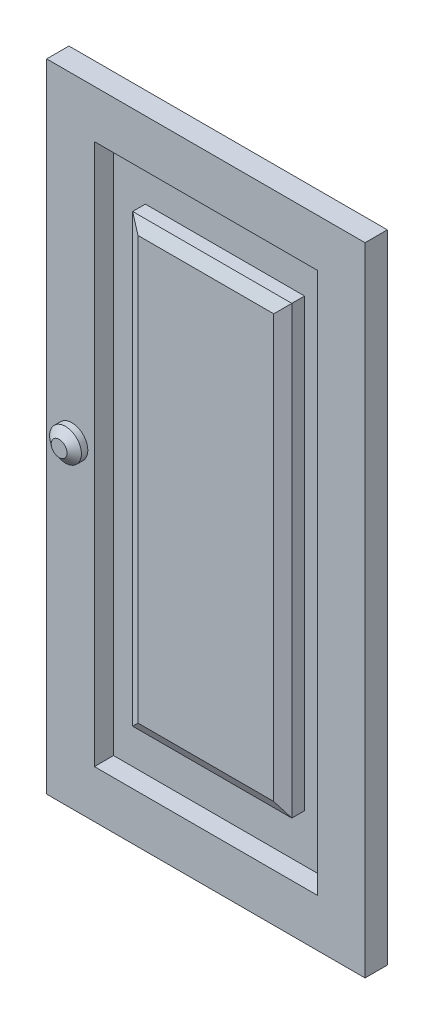
ISO-10303-21;
HEADER;
FILE_DESCRIPTION(('STEP AP214'),'2;1');
FILE_NAME('part.step','',(''),(''),'','','');
FILE_SCHEMA(('AUTOMOTIVE_DESIGN { 1 0 10303 214 1 1 1 1 }'));
ENDSEC;
DATA;
#1=APPLICATION_CONTEXT('core data for automotive mechanical design processes');
#2=APPLICATION_PROTOCOL_DEFINITION('international standard','automotive_design',2000,#1);
#3=PRODUCT_CONTEXT('',#1,'mechanical');
#4=PRODUCT('Part','Part','',(#3));
#5=PRODUCT_RELATED_PRODUCT_CATEGORY('part','',(#4));
#6=PRODUCT_DEFINITION_FORMATION('','',#4);
#7=PRODUCT_DEFINITION_CONTEXT('part definition',#1,'design');
#8=PRODUCT_DEFINITION('design','',#6,#7);
#9=PRODUCT_DEFINITION_SHAPE('','',#8);
#10=(LENGTH_UNIT() NAMED_UNIT(*) SI_UNIT(.MILLI.,.METRE.));
#11=(NAMED_UNIT(*) PLANE_ANGLE_UNIT() SI_UNIT($,.RADIAN.));
#12=(NAMED_UNIT(*) SI_UNIT($,.STERADIAN.) SOLID_ANGLE_UNIT());
#13=UNCERTAINTY_MEASURE_WITH_UNIT(LENGTH_MEASURE(1.E-05),#10,'distance_accuracy_value','');
#14=(GEOMETRIC_REPRESENTATION_CONTEXT(3) GLOBAL_UNCERTAINTY_ASSIGNED_CONTEXT((#13)) GLOBAL_UNIT_ASSIGNED_CONTEXT((#10,
#11,#12)) REPRESENTATION_CONTEXT('',''));
#15=CARTESIAN_POINT('',(0.,0.,0.));
#16=DIRECTION('',(0.,0.,1.));
#17=DIRECTION('',(1.,0.,0.));
#18=AXIS2_PLACEMENT_3D('',#15,#16,#17);
#19=CARTESIAN_POINT('',(0.,0.,0.1));
#20=DIRECTION('',(0.,0.,-1.));
#21=DIRECTION('',(-1.,0.,0.));
#22=AXIS2_PLACEMENT_3D('',#19,#20,#21);
#23=PLANE('',#22);
#24=DIRECTION('',(0.,1.,0.));
#25=VECTOR('',#24,1.);
#26=CARTESIAN_POINT('',(3.5,-8.5,0.1));
#27=LINE('',#26,#25);
#28=CARTESIAN_POINT('',(3.5,-8.5,0.1));
#29=VERTEX_POINT('',#28);
#30=CARTESIAN_POINT('',(3.5,8.5,0.1));
#31=VERTEX_POINT('',#30);
#32=EDGE_CURVE('E178',#29,#31,#27,.T.);
#33=ORIENTED_EDGE('',*,*,#32,.T.);
#34=DIRECTION('',(-1.,0.,0.));
#35=VECTOR('',#34,1.);
#36=CARTESIAN_POINT('',(-3.5,8.5,0.1));
#37=LINE('',#36,#35);
#38=CARTESIAN_POINT('',(-3.5,8.5,0.1));
#39=VERTEX_POINT('',#38);
#40=EDGE_CURVE('E181',#31,#39,#37,.T.);
#41=ORIENTED_EDGE('',*,*,#40,.T.);
#42=DIRECTION('',(0.,-1.,0.));
#43=VECTOR('',#42,1.);
#44=CARTESIAN_POINT('',(-3.5,-8.5,0.1));
#45=LINE('',#44,#43);
#46=CARTESIAN_POINT('',(-3.5,-8.5,0.1));
#47=VERTEX_POINT('',#46);
#48=EDGE_CURVE('E185',#39,#47,#45,.T.);
#49=ORIENTED_EDGE('',*,*,#48,.T.);
#50=DIRECTION('',(1.,0.,0.));
#51=VECTOR('',#50,1.);
#52=CARTESIAN_POINT('',(-3.5,-8.5,0.1));
#53=LINE('',#52,#51);
#54=EDGE_CURVE('E188',#47,#29,#53,.T.);
#55=ORIENTED_EDGE('',*,*,#54,.T.);
#56=EDGE_LOOP('',(#33,#41,#49,#55));
#57=FACE_BOUND('',#56,.T.);
#58=DIRECTION('',(0.,1.,0.));
#59=VECTOR('',#58,1.);
#60=CARTESIAN_POINT('',(2.5,-7.,0.1));
#61=LINE('',#60,#59);
#62=CARTESIAN_POINT('',(2.5,-7.,0.1));
#63=VERTEX_POINT('',#62);
#64=CARTESIAN_POINT('',(2.5,7.,0.1));
#65=VERTEX_POINT('',#64);
#66=EDGE_CURVE('E147',#63,#65,#61,.T.);
#67=ORIENTED_EDGE('',*,*,#66,.F.);
#68=DIRECTION('',(1.,0.,0.));
#69=VECTOR('',#68,1.);
#70=CARTESIAN_POINT('',(-2.5,-7.,0.1));
#71=LINE('',#70,#69);
#72=CARTESIAN_POINT('',(-2.5,-7.,0.1));
#73=VERTEX_POINT('',#72);
#74=EDGE_CURVE('E155',#73,#63,#71,.T.);
#75=ORIENTED_EDGE('',*,*,#74,.F.);
#76=DIRECTION('',(0.,-1.,0.));
#77=VECTOR('',#76,1.);
#78=CARTESIAN_POINT('',(-2.5,-7.,0.1));
#79=LINE('',#78,#77);
#80=CARTESIAN_POINT('',(-2.5,7.,0.1));
#81=VERTEX_POINT('',#80);
#82=EDGE_CURVE('E167',#81,#73,#79,.T.);
#83=ORIENTED_EDGE('',*,*,#82,.F.);
#84=DIRECTION('',(-1.,0.,0.));
#85=VECTOR('',#84,1.);
#86=CARTESIAN_POINT('',(-2.5,7.,0.1));
#87=LINE('',#86,#85);
#88=EDGE_CURVE('E163',#65,#81,#87,.T.);
#89=ORIENTED_EDGE('',*,*,#88,.F.);
#90=EDGE_LOOP('',(#67,#75,#83,#89));
#91=FACE_BOUND('',#90,.T.);
#92=ADVANCED_FACE('F41',(#57,#91),#23,.F.);
#93=CARTESIAN_POINT('',(5.,-10.,0.7));
#94=DIRECTION('',(-1.,0.,0.));
#95=DIRECTION('',(0.,0.,1.));
#96=AXIS2_PLACEMENT_3D('',#93,#94,#95);
#97=PLANE('',#96);
#98=DIRECTION('',(0.,1.,0.));
#99=VECTOR('',#98,1.);
#100=CARTESIAN_POINT('',(5.,-10.,0.));
#101=LINE('',#100,#99);
#102=CARTESIAN_POINT('',(5.,-10.,0.));
#103=VERTEX_POINT('',#102);
#104=CARTESIAN_POINT('',(5.,10.,0.));
#105=VERTEX_POINT('',#104);
#106=EDGE_CURVE('E203',#103,#105,#101,.T.);
#107=ORIENTED_EDGE('',*,*,#106,.T.);
#108=DIRECTION('',(0.,0.,-1.));
#109=VECTOR('',#108,1.);
#110=CARTESIAN_POINT('',(5.,10.,0.7));
#111=LINE('',#110,#109);
#112=CARTESIAN_POINT('',(5.,10.,0.7));
#113=VERTEX_POINT('',#112);
#114=EDGE_CURVE('E236',#113,#105,#111,.T.);
#115=ORIENTED_EDGE('',*,*,#114,.F.);
#116=DIRECTION('',(0.,1.,0.));
#117=VECTOR('',#116,1.);
#118=CARTESIAN_POINT('',(5.,-10.,0.7));
#119=LINE('',#118,#117);
#120=CARTESIAN_POINT('',(5.,-10.,0.7));
#121=VERTEX_POINT('',#120);
#122=EDGE_CURVE('E210',#121,#113,#119,.T.);
#123=ORIENTED_EDGE('',*,*,#122,.F.);
#124=DIRECTION('',(0.,0.,-1.));
#125=VECTOR('',#124,1.);
#126=CARTESIAN_POINT('',(5.,-10.,0.7));
#127=LINE('',#126,#125);
#128=EDGE_CURVE('E220',#121,#103,#127,.T.);
#129=ORIENTED_EDGE('',*,*,#128,.T.);
#130=EDGE_LOOP('',(#107,#115,#123,#129));
#131=FACE_BOUND('',#130,.T.);
#132=ADVANCED_FACE('F278',(#131),#97,.F.);
#133=CARTESIAN_POINT('',(-5.,10.,0.7));
#134=DIRECTION('',(0.,-1.,0.));
#135=DIRECTION('',(0.,0.,-1.));
#136=AXIS2_PLACEMENT_3D('',#133,#134,#135);
#137=PLANE('',#136);
#138=DIRECTION('',(-1.,0.,0.));
#139=VECTOR('',#138,1.);
#140=CARTESIAN_POINT('',(-5.,10.,0.));
#141=LINE('',#140,#139);
#142=CARTESIAN_POINT('',(-5.,10.,0.));
#143=VERTEX_POINT('',#142);
#144=EDGE_CURVE('E223',#105,#143,#141,.T.);
#145=ORIENTED_EDGE('',*,*,#144,.T.);
#146=DIRECTION('',(0.,0.,-1.));
#147=VECTOR('',#146,1.);
#148=CARTESIAN_POINT('',(-5.,10.,0.7));
#149=LINE('',#148,#147);
#150=CARTESIAN_POINT('',(-5.,10.,0.7));
#151=VERTEX_POINT('',#150);
#152=EDGE_CURVE('E233',#151,#143,#149,.T.);
#153=ORIENTED_EDGE('',*,*,#152,.F.);
#154=DIRECTION('',(-1.,0.,0.));
#155=VECTOR('',#154,1.);
#156=CARTESIAN_POINT('',(-5.,10.,0.7));
#157=LINE('',#156,#155);
#158=EDGE_CURVE('E213',#113,#151,#157,.T.);
#159=ORIENTED_EDGE('',*,*,#158,.F.);
#160=ORIENTED_EDGE('',*,*,#114,.T.);
#161=EDGE_LOOP('',(#145,#153,#159,#160));
#162=FACE_BOUND('',#161,.T.);
#163=ADVANCED_FACE('F284',(#162),#137,.F.);
#164=CARTESIAN_POINT('',(-5.,-10.,0.7));
#165=DIRECTION('',(1.,0.,0.));
#166=DIRECTION('',(0.,0.,-1.));
#167=AXIS2_PLACEMENT_3D('',#164,#165,#166);
#168=PLANE('',#167);
#169=DIRECTION('',(0.,-1.,0.));
#170=VECTOR('',#169,1.);
#171=CARTESIAN_POINT('',(-5.,-10.,0.));
#172=LINE('',#171,#170);
#173=CARTESIAN_POINT('',(-5.,-10.,0.));
#174=VERTEX_POINT('',#173);
#175=EDGE_CURVE('E225',#143,#174,#172,.T.);
#176=ORIENTED_EDGE('',*,*,#175,.T.);
#177=DIRECTION('',(0.,0.,-1.));
#178=VECTOR('',#177,1.);
#179=CARTESIAN_POINT('',(-5.,-10.,0.7));
#180=LINE('',#179,#178);
#181=CARTESIAN_POINT('',(-5.,-10.,0.7));
#182=VERTEX_POINT('',#181);
#183=EDGE_CURVE('E230',#182,#174,#180,.T.);
#184=ORIENTED_EDGE('',*,*,#183,.F.);
#185=DIRECTION('',(0.,-1.,0.));
#186=VECTOR('',#185,1.);
#187=CARTESIAN_POINT('',(-5.,-10.,0.7));
#188=LINE('',#187,#186);
#189=EDGE_CURVE('E216',#151,#182,#188,.T.);
#190=ORIENTED_EDGE('',*,*,#189,.F.);
#191=ORIENTED_EDGE('',*,*,#152,.T.);
#192=EDGE_LOOP('',(#176,#184,#190,#191));
#193=FACE_BOUND('',#192,.T.);
#194=ADVANCED_FACE('F317',(#193),#168,.F.);
#195=CARTESIAN_POINT('',(-5.,-10.,0.7));
#196=DIRECTION('',(0.,1.,0.));
#197=DIRECTION('',(0.,0.,1.));
#198=AXIS2_PLACEMENT_3D('',#195,#196,#197);
#199=PLANE('',#198);
#200=DIRECTION('',(1.,0.,0.));
#201=VECTOR('',#200,1.);
#202=CARTESIAN_POINT('',(-5.,-10.,0.));
#203=LINE('',#202,#201);
#204=EDGE_CURVE('E214',#174,#103,#203,.T.);
#205=ORIENTED_EDGE('',*,*,#204,.T.);
#206=ORIENTED_EDGE('',*,*,#128,.F.);
#207=DIRECTION('',(1.,0.,0.));
#208=VECTOR('',#207,1.);
#209=CARTESIAN_POINT('',(-5.,-10.,0.7));
#210=LINE('',#209,#208);
#211=EDGE_CURVE('E218',#182,#121,#210,.T.);
#212=ORIENTED_EDGE('',*,*,#211,.F.);
#213=ORIENTED_EDGE('',*,*,#183,.T.);
#214=EDGE_LOOP('',(#205,#206,#212,#213));
#215=FACE_BOUND('',#214,.T.);
#216=ADVANCED_FACE('F310',(#215),#199,.F.);
#217=CARTESIAN_POINT('',(0.,0.,0.7));
#218=DIRECTION('',(0.,0.,-1.));
#219=DIRECTION('',(-1.,0.,0.));
#220=AXIS2_PLACEMENT_3D('',#217,#218,#219);
#221=PLANE('',#220);
#222=CARTESIAN_POINT('',(-4.20807111775052,0.,0.7));
#223=DIRECTION('',(0.,0.,-1.));
#224=DIRECTION('',(-1.,0.,0.));
#225=AXIS2_PLACEMENT_3D('',#222,#223,#224);
#226=CIRCLE('',#225,0.5);
#227=CARTESIAN_POINT('',(-4.70807111775052,0.,0.7));
#228=VERTEX_POINT('',#227);
#229=EDGE_CURVE('E253',#228,#228,#226,.F.);
#230=ORIENTED_EDGE('',*,*,#229,.F.);
#231=EDGE_LOOP('',(#230));
#232=FACE_BOUND('',#231,.T.);
#233=DIRECTION('',(-1.,0.,0.));
#234=VECTOR('',#233,1.);
#235=CARTESIAN_POINT('',(-3.5,8.5,0.7));
#236=LINE('',#235,#234);
#237=CARTESIAN_POINT('',(3.5,8.5,0.7));
#238=VERTEX_POINT('',#237);
#239=CARTESIAN_POINT('',(-3.5,8.5,0.7));
#240=VERTEX_POINT('',#239);
#241=EDGE_CURVE('E193',#238,#240,#236,.T.);
#242=ORIENTED_EDGE('',*,*,#241,.F.);
#243=DIRECTION('',(0.,1.,0.));
#244=VECTOR('',#243,1.);
#245=CARTESIAN_POINT('',(3.5,-8.5,0.7));
#246=LINE('',#245,#244);
#247=CARTESIAN_POINT('',(3.5,-8.5,0.7));
#248=VERTEX_POINT('',#247);
#249=EDGE_CURVE('E177',#248,#238,#246,.T.);
#250=ORIENTED_EDGE('',*,*,#249,.F.);
#251=DIRECTION('',(1.,0.,0.));
#252=VECTOR('',#251,1.);
#253=CARTESIAN_POINT('',(-3.5,-8.5,0.7));
#254=LINE('',#253,#252);
#255=CARTESIAN_POINT('',(-3.5,-8.5,0.7));
#256=VERTEX_POINT('',#255);
#257=EDGE_CURVE('E182',#256,#248,#254,.T.);
#258=ORIENTED_EDGE('',*,*,#257,.F.);
#259=DIRECTION('',(0.,-1.,0.));
#260=VECTOR('',#259,1.);
#261=CARTESIAN_POINT('',(-3.5,-8.5,0.7));
#262=LINE('',#261,#260);
#263=EDGE_CURVE('E196',#240,#256,#262,.T.);
#264=ORIENTED_EDGE('',*,*,#263,.F.);
#265=EDGE_LOOP('',(#242,#250,#258,#264));
#266=FACE_BOUND('',#265,.T.);
#267=ORIENTED_EDGE('',*,*,#122,.T.);
#268=ORIENTED_EDGE('',*,*,#158,.T.);
#269=ORIENTED_EDGE('',*,*,#189,.T.);
#270=ORIENTED_EDGE('',*,*,#211,.T.);
#271=EDGE_LOOP('',(#267,#268,#269,#270));
#272=FACE_BOUND('',#271,.T.);
#273=ADVANCED_FACE('F307',(#232,#266,#272),#221,.F.);
#274=CARTESIAN_POINT('',(0.,0.,0.));
#275=DIRECTION('',(0.,0.,-1.));
#276=DIRECTION('',(-1.,0.,0.));
#277=AXIS2_PLACEMENT_3D('',#274,#275,#276);
#278=PLANE('',#277);
#279=ORIENTED_EDGE('',*,*,#106,.F.);
#280=ORIENTED_EDGE('',*,*,#204,.F.);
#281=ORIENTED_EDGE('',*,*,#175,.F.);
#282=ORIENTED_EDGE('',*,*,#144,.F.);
#283=EDGE_LOOP('',(#279,#280,#281,#282));
#284=FACE_BOUND('',#283,.T.);
#285=ADVANCED_FACE('F305',(#284),#278,.T.);
#286=CARTESIAN_POINT('',(3.5,-8.5,0.1));
#287=DIRECTION('',(1.,0.,0.));
#288=DIRECTION('',(0.,0.,-1.));
#289=AXIS2_PLACEMENT_3D('',#286,#287,#288);
#290=PLANE('',#289);
#291=ORIENTED_EDGE('',*,*,#249,.T.);
#292=DIRECTION('',(0.,0.,1.));
#293=VECTOR('',#292,1.);
#294=CARTESIAN_POINT('',(3.5,8.5,0.1));
#295=LINE('',#294,#293);
#296=EDGE_CURVE('E191',#31,#238,#295,.T.);
#297=ORIENTED_EDGE('',*,*,#296,.F.);
#298=ORIENTED_EDGE('',*,*,#32,.F.);
#299=DIRECTION('',(0.,0.,1.));
#300=VECTOR('',#299,1.);
#301=CARTESIAN_POINT('',(3.5,-8.5,0.1));
#302=LINE('',#301,#300);
#303=EDGE_CURVE('E201',#29,#248,#302,.T.);
#304=ORIENTED_EDGE('',*,*,#303,.T.);
#305=EDGE_LOOP('',(#291,#297,#298,#304));
#306=FACE_BOUND('',#305,.T.);
#307=ADVANCED_FACE('F294',(#306),#290,.F.);
#308=CARTESIAN_POINT('',(-3.5,-8.5,0.1));
#309=DIRECTION('',(0.,-1.,0.));
#310=DIRECTION('',(0.,0.,-1.));
#311=AXIS2_PLACEMENT_3D('',#308,#309,#310);
#312=PLANE('',#311);
#313=ORIENTED_EDGE('',*,*,#257,.T.);
#314=ORIENTED_EDGE('',*,*,#303,.F.);
#315=ORIENTED_EDGE('',*,*,#54,.F.);
#316=DIRECTION('',(0.,0.,1.));
#317=VECTOR('',#316,1.);
#318=CARTESIAN_POINT('',(-3.5,-8.5,0.1));
#319=LINE('',#318,#317);
#320=EDGE_CURVE('E204',#47,#256,#319,.T.);
#321=ORIENTED_EDGE('',*,*,#320,.T.);
#322=EDGE_LOOP('',(#313,#314,#315,#321));
#323=FACE_BOUND('',#322,.T.);
#324=ADVANCED_FACE('F290',(#323),#312,.F.);
#325=CARTESIAN_POINT('',(-3.5,-8.5,0.1));
#326=DIRECTION('',(-1.,0.,0.));
#327=DIRECTION('',(0.,0.,1.));
#328=AXIS2_PLACEMENT_3D('',#325,#326,#327);
#329=PLANE('',#328);
#330=ORIENTED_EDGE('',*,*,#263,.T.);
#331=ORIENTED_EDGE('',*,*,#320,.F.);
#332=ORIENTED_EDGE('',*,*,#48,.F.);
#333=DIRECTION('',(0.,0.,1.));
#334=VECTOR('',#333,1.);
#335=CARTESIAN_POINT('',(-3.5,8.5,0.1));
#336=LINE('',#335,#334);
#337=EDGE_CURVE('E206',#39,#240,#336,.T.);
#338=ORIENTED_EDGE('',*,*,#337,.T.);
#339=EDGE_LOOP('',(#330,#331,#332,#338));
#340=FACE_BOUND('',#339,.T.);
#341=ADVANCED_FACE('F293',(#340),#329,.F.);
#342=CARTESIAN_POINT('',(-3.5,8.5,0.1));
#343=DIRECTION('',(0.,1.,0.));
#344=DIRECTION('',(0.,0.,1.));
#345=AXIS2_PLACEMENT_3D('',#342,#343,#344);
#346=PLANE('',#345);
#347=ORIENTED_EDGE('',*,*,#241,.T.);
#348=ORIENTED_EDGE('',*,*,#337,.F.);
#349=ORIENTED_EDGE('',*,*,#40,.F.);
#350=ORIENTED_EDGE('',*,*,#296,.T.);
#351=EDGE_LOOP('',(#347,#348,#349,#350));
#352=FACE_BOUND('',#351,.T.);
#353=ADVANCED_FACE('F298',(#352),#346,.F.);
#354=CARTESIAN_POINT('',(2.5,-7.,0.7));
#355=DIRECTION('',(-1.,0.,0.));
#356=DIRECTION('',(0.,0.,1.));
#357=AXIS2_PLACEMENT_3D('',#354,#355,#356);
#358=PLANE('',#357);
#359=DIRECTION('',(0.,0.,-1.));
#360=VECTOR('',#359,1.);
#361=CARTESIAN_POINT('',(2.5,7.,0.7));
#362=LINE('',#361,#360);
#363=CARTESIAN_POINT('',(2.5,7.,0.500000000000001));
#364=VERTEX_POINT('',#363);
#365=EDGE_CURVE('E175',#364,#65,#362,.T.);
#366=ORIENTED_EDGE('',*,*,#365,.F.);
#367=DIRECTION('',(0.,-1.,0.));
#368=VECTOR('',#367,1.);
#369=CARTESIAN_POINT('',(2.5,-7.,0.500000000000001));
#370=LINE('',#369,#368);
#371=CARTESIAN_POINT('',(2.5,-7.,0.500000000000001));
#372=VERTEX_POINT('',#371);
#373=EDGE_CURVE('E149',#364,#372,#370,.T.);
#374=ORIENTED_EDGE('',*,*,#373,.T.);
#375=DIRECTION('',(0.,0.,-1.));
#376=VECTOR('',#375,1.);
#377=CARTESIAN_POINT('',(2.5,-7.,0.7));
#378=LINE('',#377,#376);
#379=EDGE_CURVE('E144',#372,#63,#378,.T.);
#380=ORIENTED_EDGE('',*,*,#379,.T.);
#381=ORIENTED_EDGE('',*,*,#66,.T.);
#382=EDGE_LOOP('',(#366,#374,#380,#381));
#383=FACE_BOUND('',#382,.T.);
#384=ADVANCED_FACE('F146',(#383),#358,.F.);
#385=CARTESIAN_POINT('',(-2.5,7.,0.7));
#386=DIRECTION('',(0.,-1.,0.));
#387=DIRECTION('',(0.,0.,-1.));
#388=AXIS2_PLACEMENT_3D('',#385,#386,#387);
#389=PLANE('',#388);
#390=DIRECTION('',(0.,0.,-1.));
#391=VECTOR('',#390,1.);
#392=CARTESIAN_POINT('',(-2.5,7.,0.7));
#393=LINE('',#392,#391);
#394=CARTESIAN_POINT('',(-2.5,7.,0.500000000000001));
#395=VERTEX_POINT('',#394);
#396=EDGE_CURVE('E173',#395,#81,#393,.T.);
#397=ORIENTED_EDGE('',*,*,#396,.F.);
#398=DIRECTION('',(1.,0.,0.));
#399=VECTOR('',#398,1.);
#400=CARTESIAN_POINT('',(-2.5,7.,0.500000000000001));
#401=LINE('',#400,#399);
#402=EDGE_CURVE('E57',#395,#364,#401,.T.);
#403=ORIENTED_EDGE('',*,*,#402,.T.);
#404=ORIENTED_EDGE('',*,*,#365,.T.);
#405=ORIENTED_EDGE('',*,*,#88,.T.);
#406=EDGE_LOOP('',(#397,#403,#404,#405));
#407=FACE_BOUND('',#406,.T.);
#408=ADVANCED_FACE('F365',(#407),#389,.F.);
#409=CARTESIAN_POINT('',(-2.5,-7.,0.7));
#410=DIRECTION('',(1.,0.,0.));
#411=DIRECTION('',(0.,0.,-1.));
#412=AXIS2_PLACEMENT_3D('',#409,#410,#411);
#413=PLANE('',#412);
#414=DIRECTION('',(0.,0.,-1.));
#415=VECTOR('',#414,1.);
#416=CARTESIAN_POINT('',(-2.5,-7.,0.7));
#417=LINE('',#416,#415);
#418=CARTESIAN_POINT('',(-2.5,-7.,0.500000000000001));
#419=VERTEX_POINT('',#418);
#420=EDGE_CURVE('E154',#419,#73,#417,.T.);
#421=ORIENTED_EDGE('',*,*,#420,.F.);
#422=DIRECTION('',(0.,1.,0.));
#423=VECTOR('',#422,1.);
#424=CARTESIAN_POINT('',(-2.5,-7.,0.500000000000001));
#425=LINE('',#424,#423);
#426=EDGE_CURVE('E65',#419,#395,#425,.T.);
#427=ORIENTED_EDGE('',*,*,#426,.T.);
#428=ORIENTED_EDGE('',*,*,#396,.T.);
#429=ORIENTED_EDGE('',*,*,#82,.T.);
#430=EDGE_LOOP('',(#421,#427,#428,#429));
#431=FACE_BOUND('',#430,.T.);
#432=ADVANCED_FACE('F364',(#431),#413,.F.);
#433=CARTESIAN_POINT('',(-2.5,-7.,0.7));
#434=DIRECTION('',(0.,1.,0.));
#435=DIRECTION('',(0.,0.,1.));
#436=AXIS2_PLACEMENT_3D('',#433,#434,#435);
#437=PLANE('',#436);
#438=ORIENTED_EDGE('',*,*,#379,.F.);
#439=DIRECTION('',(-1.,0.,0.));
#440=VECTOR('',#439,1.);
#441=CARTESIAN_POINT('',(-2.5,-7.,0.500000000000001));
#442=LINE('',#441,#440);
#443=EDGE_CURVE('E248',#372,#419,#442,.T.);
#444=ORIENTED_EDGE('',*,*,#443,.T.);
#445=ORIENTED_EDGE('',*,*,#420,.T.);
#446=ORIENTED_EDGE('',*,*,#74,.T.);
#447=EDGE_LOOP('',(#438,#444,#445,#446));
#448=FACE_BOUND('',#447,.T.);
#449=ADVANCED_FACE('F166',(#448),#437,.F.);
#450=CARTESIAN_POINT('',(0.,0.,0.7));
#451=DIRECTION('',(0.,0.,-1.));
#452=DIRECTION('',(-1.,0.,0.));
#453=AXIS2_PLACEMENT_3D('',#450,#451,#452);
#454=PLANE('',#453);
#455=DIRECTION('',(0.,-1.,0.));
#456=VECTOR('',#455,1.);
#457=CARTESIAN_POINT('',(-2.13164582279331,0.,0.7));
#458=LINE('',#457,#456);
#459=CARTESIAN_POINT('',(-2.13164582279331,6.63164582279331,0.7));
#460=VERTEX_POINT('',#459);
#461=CARTESIAN_POINT('',(-2.13164582279331,-6.63164582279331,0.7));
#462=VERTEX_POINT('',#461);
#463=EDGE_CURVE('E243',#460,#462,#458,.T.);
#464=ORIENTED_EDGE('',*,*,#463,.T.);
#465=DIRECTION('',(1.,0.,0.));
#466=VECTOR('',#465,1.);
#467=CARTESIAN_POINT('',(0.,-6.63164582279331,0.7));
#468=LINE('',#467,#466);
#469=CARTESIAN_POINT('',(2.13164582279331,-6.63164582279331,0.7));
#470=VERTEX_POINT('',#469);
#471=EDGE_CURVE('E245',#462,#470,#468,.T.);
#472=ORIENTED_EDGE('',*,*,#471,.T.);
#473=DIRECTION('',(0.,1.,0.));
#474=VECTOR('',#473,1.);
#475=CARTESIAN_POINT('',(2.13164582279331,0.,0.7));
#476=LINE('',#475,#474);
#477=CARTESIAN_POINT('',(2.13164582279331,6.63164582279331,0.7));
#478=VERTEX_POINT('',#477);
#479=EDGE_CURVE('E239',#470,#478,#476,.T.);
#480=ORIENTED_EDGE('',*,*,#479,.T.);
#481=DIRECTION('',(-1.,0.,0.));
#482=VECTOR('',#481,1.);
#483=CARTESIAN_POINT('',(0.,6.63164582279331,0.7));
#484=LINE('',#483,#482);
#485=EDGE_CURVE('E241',#478,#460,#484,.T.);
#486=ORIENTED_EDGE('',*,*,#485,.T.);
#487=EDGE_LOOP('',(#464,#472,#480,#486));
#488=FACE_BOUND('',#487,.T.);
#489=ADVANCED_FACE('F350',(#488),#454,.F.);
#490=CARTESIAN_POINT('',(0.,6.63164582279331,0.7));
#491=DIRECTION('',(0.,-0.477158760259606,-0.878817112661967));
#492=DIRECTION('',(-1.,0.,0.));
#493=AXIS2_PLACEMENT_3D('',#490,#491,#492);
#494=PLANE('',#493);
#495=DIRECTION('',(-0.66012699805616,-0.66012699805616,0.358419716079801));
#496=VECTOR('',#495,1.);
#497=CARTESIAN_POINT('',(-0.758210916663797,3.7417890833362,2.26906418782678));
#498=LINE('',#497,#496);
#499=EDGE_CURVE('E258',#364,#478,#498,.T.);
#500=ORIENTED_EDGE('',*,*,#499,.F.);
#501=ORIENTED_EDGE('',*,*,#402,.F.);
#502=DIRECTION('',(0.66012699805616,-0.66012699805616,0.358419716079801));
#503=VECTOR('',#502,1.);
#504=CARTESIAN_POINT('',(-1.20274352436807,5.70274352436807,1.20435279733722));
#505=LINE('',#504,#503);
#506=EDGE_CURVE('E164',#460,#395,#505,.F.);
#507=ORIENTED_EDGE('',*,*,#506,.F.);
#508=ORIENTED_EDGE('',*,*,#485,.F.);
#509=EDGE_LOOP('',(#500,#501,#507,#508));
#510=FACE_BOUND('',#509,.T.);
#511=ADVANCED_FACE('F345',(#510),#494,.F.);
#512=CARTESIAN_POINT('',(-2.13164582279331,0.,0.7));
#513=DIRECTION('',(0.477158760259606,0.,-0.878817112661967));
#514=DIRECTION('',(0.,-1.,0.));
#515=AXIS2_PLACEMENT_3D('',#512,#513,#514);
#516=PLANE('',#515);
#517=ORIENTED_EDGE('',*,*,#506,.T.);
#518=ORIENTED_EDGE('',*,*,#426,.F.);
#519=DIRECTION('',(0.66012699805616,0.66012699805616,0.358419716079801));
#520=VECTOR('',#519,1.);
#521=CARTESIAN_POINT('',(0.758210916663797,-3.7417890833362,2.26906418782678));
#522=LINE('',#521,#520);
#523=EDGE_CURVE('E256',#462,#419,#522,.F.);
#524=ORIENTED_EDGE('',*,*,#523,.F.);
#525=ORIENTED_EDGE('',*,*,#463,.F.);
#526=EDGE_LOOP('',(#517,#518,#524,#525));
#527=FACE_BOUND('',#526,.T.);
#528=ADVANCED_FACE('F339',(#527),#516,.F.);
#529=CARTESIAN_POINT('',(2.13164582279331,0.,0.7));
#530=DIRECTION('',(-0.477158760259606,0.,-0.878817112661967));
#531=DIRECTION('',(0.,1.,0.));
#532=AXIS2_PLACEMENT_3D('',#529,#530,#531);
#533=PLANE('',#532);
#534=ORIENTED_EDGE('',*,*,#499,.T.);
#535=ORIENTED_EDGE('',*,*,#479,.F.);
#536=DIRECTION('',(0.66012699805616,-0.66012699805616,-0.358419716079801));
#537=VECTOR('',#536,1.);
#538=CARTESIAN_POINT('',(-0.758210916663797,-3.7417890833362,2.26906418782678));
#539=LINE('',#538,#537);
#540=EDGE_CURVE('E254',#372,#470,#539,.F.);
#541=ORIENTED_EDGE('',*,*,#540,.F.);
#542=ORIENTED_EDGE('',*,*,#373,.F.);
#543=EDGE_LOOP('',(#534,#535,#541,#542));
#544=FACE_BOUND('',#543,.T.);
#545=ADVANCED_FACE('F332',(#544),#533,.F.);
#546=CARTESIAN_POINT('',(0.,-6.63164582279331,0.7));
#547=DIRECTION('',(0.,0.477158760259606,-0.878817112661967));
#548=DIRECTION('',(1.,0.,0.));
#549=AXIS2_PLACEMENT_3D('',#546,#547,#548);
#550=PLANE('',#549);
#551=ORIENTED_EDGE('',*,*,#523,.T.);
#552=ORIENTED_EDGE('',*,*,#443,.F.);
#553=ORIENTED_EDGE('',*,*,#540,.T.);
#554=ORIENTED_EDGE('',*,*,#471,.F.);
#555=EDGE_LOOP('',(#551,#552,#553,#554));
#556=FACE_BOUND('',#555,.T.);
#557=ADVANCED_FACE('F326',(#556),#550,.F.);
#558=CARTESIAN_POINT('',(-4.20807111775052,0.,1.1));
#559=DIRECTION('',(0.,0.,-1.));
#560=DIRECTION('',(-1.,0.,0.));
#561=AXIS2_PLACEMENT_3D('',#558,#559,#560);
#562=CYLINDRICAL_SURFACE('',#561,0.5);
#563=CARTESIAN_POINT('',(-4.20807111775052,0.,0.9));
#564=DIRECTION('',(0.,0.,1.));
#565=DIRECTION('',(1.,0.,0.));
#566=AXIS2_PLACEMENT_3D('',#563,#564,#565);
#567=CIRCLE('',#566,0.5);
#568=CARTESIAN_POINT('',(-3.70807111775052,0.,0.9));
#569=VERTEX_POINT('',#568);
#570=EDGE_CURVE('E11',#569,#569,#567,.F.);
#571=ORIENTED_EDGE('',*,*,#570,.T.);
#572=EDGE_LOOP('',(#571));
#573=FACE_BOUND('',#572,.T.);
#574=ORIENTED_EDGE('',*,*,#229,.T.);
#575=EDGE_LOOP('',(#574));
#576=FACE_BOUND('',#575,.T.);
#577=ADVANCED_FACE('F274',(#573,#576),#562,.T.);
#578=CARTESIAN_POINT('',(-4.20807111775052,0.,1.1));
#579=DIRECTION('',(0.,0.,1.));
#580=DIRECTION('',(1.,0.,0.));
#581=AXIS2_PLACEMENT_3D('',#578,#579,#580);
#582=PLANE('',#581);
#583=CARTESIAN_POINT('',(-4.20807111775052,0.,1.1));
#584=DIRECTION('',(0.,0.,1.));
#585=DIRECTION('',(1.,0.,0.));
#586=AXIS2_PLACEMENT_3D('',#583,#584,#585);
#587=CIRCLE('',#586,0.248565540216208);
#588=CARTESIAN_POINT('',(-3.95950557753431,0.,1.1));
#589=VERTEX_POINT('',#588);
#590=EDGE_CURVE('E50',#589,#589,#587,.T.);
#591=ORIENTED_EDGE('',*,*,#590,.T.);
#592=EDGE_LOOP('',(#591));
#593=FACE_BOUND('',#592,.T.);
#594=ADVANCED_FACE('F267',(#593),#582,.T.);
#595=CARTESIAN_POINT('',(-4.20807111775052,0.,1.1));
#596=DIRECTION('',(0.,0.,-1.));
#597=DIRECTION('',(-1.,0.,0.));
#598=AXIS2_PLACEMENT_3D('',#595,#596,#597);
#599=CONICAL_SURFACE('',#598,0.248565540216208,0.898844564777081);
#600=ORIENTED_EDGE('',*,*,#570,.F.);
#601=EDGE_LOOP('',(#600));
#602=FACE_BOUND('',#601,.T.);
#603=ORIENTED_EDGE('',*,*,#590,.F.);
#604=EDGE_LOOP('',(#603));
#605=FACE_BOUND('',#604,.T.);
#606=ADVANCED_FACE('F44',(#602,#605),#599,.T.);
#607=CLOSED_SHELL('',(#92,#132,#163,#194,#216,#273,#285,#307,#324,#341,#353,#384,#408,#432,#449,
#489,#511,#528,#545,#557,#577,#594,#606));
#608=MANIFOLD_SOLID_BREP('B2',#607);
#609=ADVANCED_BREP_SHAPE_REPRESENTATION('',(#18,#608),#14);
#610=SHAPE_DEFINITION_REPRESENTATION(#9,#609);
ENDSEC;
END-ISO-10303-21;
